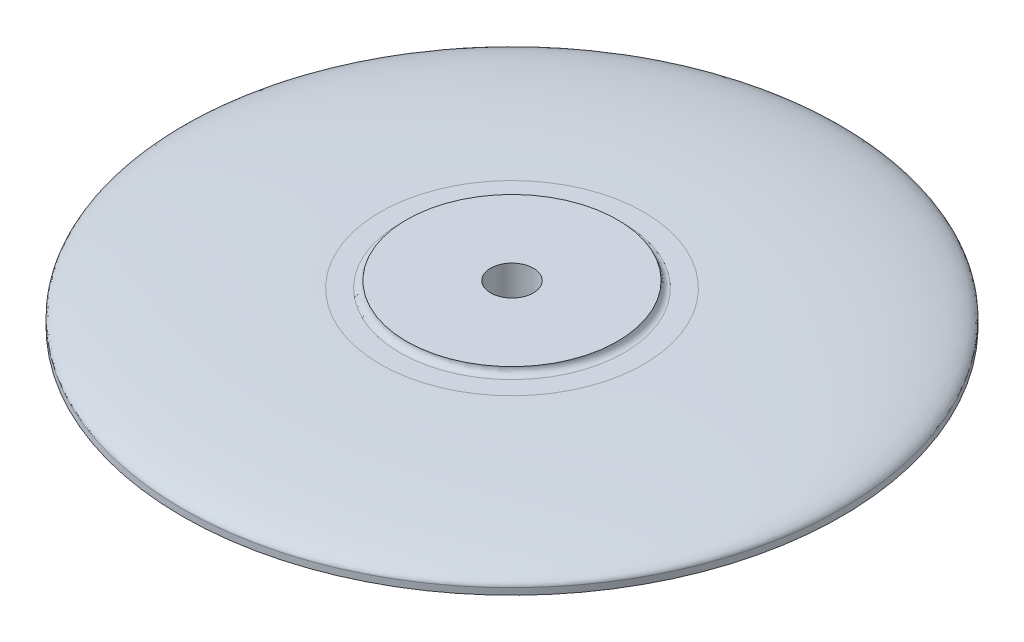
ISO-10303-21;
HEADER;
FILE_DESCRIPTION(('STEP AP214'),'2;1');
FILE_NAME('part.step','',(''),(''),'','','');
FILE_SCHEMA(('AUTOMOTIVE_DESIGN { 1 0 10303 214 1 1 1 1 }'));
ENDSEC;
DATA;
#1=APPLICATION_CONTEXT('core data for automotive mechanical design processes');
#2=APPLICATION_PROTOCOL_DEFINITION('international standard','automotive_design',2000,#1);
#3=PRODUCT_CONTEXT('',#1,'mechanical');
#4=PRODUCT('Part','Part','',(#3));
#5=PRODUCT_RELATED_PRODUCT_CATEGORY('part','',(#4));
#6=PRODUCT_DEFINITION_FORMATION('','',#4);
#7=PRODUCT_DEFINITION_CONTEXT('part definition',#1,'design');
#8=PRODUCT_DEFINITION('design','',#6,#7);
#9=PRODUCT_DEFINITION_SHAPE('','',#8);
#10=(LENGTH_UNIT() NAMED_UNIT(*) SI_UNIT(.MILLI.,.METRE.));
#11=(NAMED_UNIT(*) PLANE_ANGLE_UNIT() SI_UNIT($,.RADIAN.));
#12=(NAMED_UNIT(*) SI_UNIT($,.STERADIAN.) SOLID_ANGLE_UNIT());
#13=UNCERTAINTY_MEASURE_WITH_UNIT(LENGTH_MEASURE(1.E-05),#10,'distance_accuracy_value','');
#14=(GEOMETRIC_REPRESENTATION_CONTEXT(3) GLOBAL_UNCERTAINTY_ASSIGNED_CONTEXT((#13)) GLOBAL_UNIT_ASSIGNED_CONTEXT((#10,
#11,#12)) REPRESENTATION_CONTEXT('',''));
#15=CARTESIAN_POINT('',(0.,0.,0.));
#16=DIRECTION('',(0.,0.,1.));
#17=DIRECTION('',(1.,0.,0.));
#18=AXIS2_PLACEMENT_3D('',#15,#16,#17);
#19=CARTESIAN_POINT('',(0.,5.,0.));
#20=DIRECTION('',(0.,-1.,0.));
#21=DIRECTION('',(0.,0.,-1.));
#22=AXIS2_PLACEMENT_3D('',#19,#20,#21);
#23=CYLINDRICAL_SURFACE('',#22,50.);
#24=CARTESIAN_POINT('',(0.,1.,50.));
#25=CARTESIAN_POINT('',(3.27249234613003,1.,50.));
#26=CARTESIAN_POINT('',(6.54490377749344,1.,49.6776956057626));
#27=CARTESIAN_POINT('',(12.9641284241194,1.,48.4008324345604));
#28=CARTESIAN_POINT('',(16.1107829193642,1.,47.4463052289703));
#29=CARTESIAN_POINT('',(22.1575603171448,1.,44.9416480221584));
#30=CARTESIAN_POINT('',(25.0575337086838,1.,43.3915799504193));
#31=CARTESIAN_POINT('',(30.4994895932765,1.,39.7553812798352));
#32=CARTESIAN_POINT('',(33.0413375300017,1.,37.6693405886531));
#33=CARTESIAN_POINT('',(37.6693405886531,1.,33.0413375300017));
#34=CARTESIAN_POINT('',(39.7553812798342,1.,30.499489593278));
#35=CARTESIAN_POINT('',(43.3915799504203,1.,25.0575337086822));
#36=CARTESIAN_POINT('',(44.9416480221603,1.,22.1575603171404));
#37=CARTESIAN_POINT('',(47.4463052289684,1.,16.1107829193686));
#38=CARTESIAN_POINT('',(48.4008324345603,1.,12.9641284241197));
#39=CARTESIAN_POINT('',(49.6776956057627,1.,6.54490377749318));
#40=CARTESIAN_POINT('',(50.,1.,3.27249234612583));
#41=CARTESIAN_POINT('',(50.,1.,-3.27249234612583));
#42=CARTESIAN_POINT('',(49.6776956057629,1.,-6.54490377749224));
#43=CARTESIAN_POINT('',(48.4008324345602,1.,-12.9641284241205));
#44=CARTESIAN_POINT('',(47.4463052289684,1.,-16.1107829193686));
#45=CARTESIAN_POINT('',(44.9416480221603,1.,-22.1575603171404));
#46=CARTESIAN_POINT('',(43.3915799504191,1.,-25.057533708684));
#47=CARTESIAN_POINT('',(39.7553812798354,1.,-30.4994895932762));
#48=CARTESIAN_POINT('',(37.6693405886559,1.,-33.0413375299988));
#49=CARTESIAN_POINT('',(33.0413375299988,1.,-37.669340588656));
#50=CARTESIAN_POINT('',(30.4994895932736,1.,-39.7553812798371));
#51=CARTESIAN_POINT('',(25.0575337086867,1.,-43.3915799504174));
#52=CARTESIAN_POINT('',(22.1575603171371,1.,-44.9416480221616));
#53=CARTESIAN_POINT('',(16.110782919372,1.,-47.446305228967));
#54=CARTESIAN_POINT('',(12.9641284241176,1.,-48.4008324345608));
#55=CARTESIAN_POINT('',(6.54490377749531,1.,-49.6776956057623));
#56=CARTESIAN_POINT('',(3.27249234612584,1.,-50.));
#57=CARTESIAN_POINT('',(-3.27249234612583,1.,-50.));
#58=CARTESIAN_POINT('',(-6.54490377749304,1.,-49.6776956057627));
#59=CARTESIAN_POINT('',(-12.9641284241197,1.,-48.4008324345604));
#60=CARTESIAN_POINT('',(-16.1107829193699,1.,-47.4463052289679));
#61=CARTESIAN_POINT('',(-22.1575603171389,1.,-44.9416480221609));
#62=CARTESIAN_POINT('',(-25.0575337086829,1.,-43.3915799504198));
#63=CARTESIAN_POINT('',(-30.4994895932772,1.,-39.7553812798347));
#64=CARTESIAN_POINT('',(-33.0413375299988,1.,-37.6693405886559));
#65=CARTESIAN_POINT('',(-37.669340588656,1.,-33.0413375299988));
#66=CARTESIAN_POINT('',(-39.7553812798357,1.,-30.4994895932757));
#67=CARTESIAN_POINT('',(-43.3915799504188,1.,-25.0575337086846));
#68=CARTESIAN_POINT('',(-44.9416480221609,1.,-22.1575603171387));
#69=CARTESIAN_POINT('',(-47.4463052289677,1.,-16.1107829193704));
#70=CARTESIAN_POINT('',(-48.4008324345606,1.,-12.9641284241185));
#71=CARTESIAN_POINT('',(-49.6776956057624,1.,-6.54490377749446));
#72=CARTESIAN_POINT('',(-50.,1.,-3.27249234612575));
#73=CARTESIAN_POINT('',(-50.,1.,3.27249234612591));
#74=CARTESIAN_POINT('',(-49.6776956057629,1.,6.54490377749217));
#75=CARTESIAN_POINT('',(-48.4008324345602,1.,12.9641284241206));
#76=CARTESIAN_POINT('',(-47.4463052289671,1.,16.1107829193719));
#77=CARTESIAN_POINT('',(-44.9416480221617,1.,22.157560317137));
#78=CARTESIAN_POINT('',(-43.3915799504198,1.,25.057533708683));
#79=CARTESIAN_POINT('',(-39.7553812798347,1.,30.4994895932772));
#80=CARTESIAN_POINT('',(-37.6693405886538,1.,33.041337530001));
#81=CARTESIAN_POINT('',(-33.0413375300012,1.,37.6693405886536));
#82=CARTESIAN_POINT('',(-30.499489593271,1.,39.7553812798389));
#83=CARTESIAN_POINT('',(-25.0575337086893,1.,43.3915799504156));
#84=CARTESIAN_POINT('',(-22.1575603171406,1.,44.9416480221601));
#85=CARTESIAN_POINT('',(-16.1107829193685,1.,47.4463052289685));
#86=CARTESIAN_POINT('',(-12.9641284241189,1.,48.4008324345605));
#87=CARTESIAN_POINT('',(-6.54490377749402,1.,49.6776956057625));
#88=CARTESIAN_POINT('',(-3.27249234613004,1.,50.));
#89=CARTESIAN_POINT('',(0.,1.,50.));
#90=(BOUNDED_CURVE() B_SPLINE_CURVE(3,(#24,#25,#26,#27,#28,#29,#30,#31,#32,#33,#34,#35,#36,#37,
#38,#39,#40,#41,#42,#43,#44,#45,#46,#47,#48,#49,#50,#51,#52,#53,#54,#55,#56,#57,#58,#59,#60,#61,
#62,#63,#64,#65,#66,#67,#68,#69,#70,#71,#72,#73,#74,#75,#76,#77,#78,#79,#80,#81,#82,#83,#84,#85,
#86,#87,#88,#89),.UNSPECIFIED.,.T.,.F.) B_SPLINE_CURVE_WITH_KNOTS((4,2,2,2,2,2,2,2,2,2,2,2,2,2,
2,2,2,2,2,2,2,2,2,2,2,2,2,2,2,2,2,2,4),(0.,0.196349540849362,0.392699081698724,
0.589048622548086,0.785398163397448,0.98174770424681,1.17809724509617,1.37444678594553,
1.5707963267949,1.76714586764426,1.96349540849362,2.15984494934298,2.35619449019234,
2.55254403104171,2.74889357189107,2.94524311274043,3.14159265358979,3.33794219443916,
3.53429173528852,3.73064127613788,3.92699081698724,4.1233403578366,4.31968989868597,
4.51603943953533,4.71238898038469,4.90873852123405,5.10508806208341,5.30143760293278,
5.49778714378214,5.6941366846315,5.89048622548086,6.08683576633022,6.28318530717959),
.UNSPECIFIED.) CURVE() GEOMETRIC_REPRESENTATION_ITEM() RATIONAL_B_SPLINE_CURVE((1.,1.,1.,1.,1.,
1.,1.,1.,1.,1.,1.,1.,1.,1.,1.,1.,1.,1.,1.,1.,1.,1.,1.,1.,1.,1.,1.,1.,1.,1.,1.,1.,1.,1.,1.,1.,1.,
1.,1.,1.,1.,1.,1.,1.,1.,1.,1.,1.,1.,1.,1.,1.,1.,1.,1.,1.,1.,1.,1.,1.,1.,1.,1.,1.,1.,1.)) REPRESENTATION_ITEM(''));
#91=CARTESIAN_POINT('',(0.,1.,50.));
#92=VERTEX_POINT('',#91);
#93=EDGE_CURVE('E12',#92,#92,#90,.F.);
#94=ORIENTED_EDGE('',*,*,#93,.T.);
#95=EDGE_LOOP('',(#94));
#96=FACE_BOUND('',#95,.T.);
#97=CARTESIAN_POINT('',(0.,0.,0.));
#98=DIRECTION('',(0.,1.,0.));
#99=DIRECTION('',(0.,0.,1.));
#100=AXIS2_PLACEMENT_3D('',#97,#98,#99);
#101=CIRCLE('',#100,50.);
#102=CARTESIAN_POINT('',(0.,0.,50.));
#103=VERTEX_POINT('',#102);
#104=EDGE_CURVE('E74',#103,#103,#101,.T.);
#105=ORIENTED_EDGE('',*,*,#104,.T.);
#106=EDGE_LOOP('',(#105));
#107=FACE_BOUND('',#106,.T.);
#108=ADVANCED_FACE('F51',(#96,#107),#23,.T.);
#109=CARTESIAN_POINT('',(0.,5.,0.));
#110=DIRECTION('',(0.,1.,0.));
#111=DIRECTION('',(0.,0.,1.));
#112=AXIS2_PLACEMENT_3D('',#109,#110,#111);
#113=PLANE('',#112);
#114=CARTESIAN_POINT('',(0.,5.,20.));
#115=CARTESIAN_POINT('',(-1.30899693845201,5.,20.));
#116=CARTESIAN_POINT('',(-2.61796151099756,5.,19.8710782423041));
#117=CARTESIAN_POINT('',(-5.18565136964763,5.,19.3603329738251));
#118=CARTESIAN_POINT('',(-6.44431316774772,5.,18.9785220915877));
#119=CARTESIAN_POINT('',(-8.86302412685592,5.,17.9766592088637));
#120=CARTESIAN_POINT('',(-10.0230134834748,5.,17.3566319801684));
#121=CARTESIAN_POINT('',(-12.1997958373094,5.,15.9021525119334));
#122=CARTESIAN_POINT('',(-13.2165350120011,5.,15.0677362354608));
#123=CARTESIAN_POINT('',(-15.0677362354608,5.,13.2165350120011));
#124=CARTESIAN_POINT('',(-15.9021525119334,5.,12.1997958373093));
#125=CARTESIAN_POINT('',(-17.3566319801684,5.,10.0230134834747));
#126=CARTESIAN_POINT('',(-17.9766592088637,5.,8.8630241268553));
#127=CARTESIAN_POINT('',(-18.9785220915878,5.,6.44431316774823));
#128=CARTESIAN_POINT('',(-19.3603329738229,5.,5.18565136964758));
#129=CARTESIAN_POINT('',(-19.8710782423063,5.,2.61796151099751));
#130=CARTESIAN_POINT('',(-20.,5.,1.30899693845037));
#131=CARTESIAN_POINT('',(-20.,5.,-1.3089969384503));
#132=CARTESIAN_POINT('',(-19.8710782423041,5.,-2.61796151099784));
#133=CARTESIAN_POINT('',(-19.3603329738251,5.,-5.18565136964734));
#134=CARTESIAN_POINT('',(-18.9785220915877,5.,-6.44431316774772));
#135=CARTESIAN_POINT('',(-17.9766592088637,5.,-8.86302412685592));
#136=CARTESIAN_POINT('',(-17.3566319801662,5.,-10.0230134834736));
#137=CARTESIAN_POINT('',(-15.9021525119356,5.,-12.1997958373105));
#138=CARTESIAN_POINT('',(-15.0677362354619,5.,-13.216535012));
#139=CARTESIAN_POINT('',(-13.216535012,5.,-15.0677362354619));
#140=CARTESIAN_POINT('',(-12.1997958373105,5.,-15.9021525119357));
#141=CARTESIAN_POINT('',(-10.0230134834736,5.,-17.3566319801662));
#142=CARTESIAN_POINT('',(-8.86302412685587,5.,-17.9766592088637));
#143=CARTESIAN_POINT('',(-6.44431316774767,5.,-18.9785220915878));
#144=CARTESIAN_POINT('',(-5.18565136964758,5.,-19.3603329738229));
#145=CARTESIAN_POINT('',(-2.61796151099752,5.,-19.8710782423063));
#146=CARTESIAN_POINT('',(-1.30899693845033,5.,-20.));
#147=CARTESIAN_POINT('',(1.30899693845034,5.,-20.));
#148=CARTESIAN_POINT('',(2.61796151099783,5.,-19.8710782423041));
#149=CARTESIAN_POINT('',(5.18565136964733,5.,-19.3603329738251));
#150=CARTESIAN_POINT('',(6.44431316774772,5.,-18.9785220915855));
#151=CARTESIAN_POINT('',(8.86302412685593,5.,-17.976659208866));
#152=CARTESIAN_POINT('',(10.0230134834736,5.,-17.3566319801662));
#153=CARTESIAN_POINT('',(12.1997958373105,5.,-15.9021525119356));
#154=CARTESIAN_POINT('',(13.216535012,5.,-15.0677362354619));
#155=CARTESIAN_POINT('',(15.0677362354619,5.,-13.216535012));
#156=CARTESIAN_POINT('',(15.9021525119357,5.,-12.1997958373116));
#157=CARTESIAN_POINT('',(17.3566319801662,5.,-10.0230134834725));
#158=CARTESIAN_POINT('',(17.976659208866,5.,-8.86302412685678));
#159=CARTESIAN_POINT('',(18.9785220915855,5.,-6.44431316774683));
#160=CARTESIAN_POINT('',(19.360332973824,5.,-5.18565136964756));
#161=CARTESIAN_POINT('',(19.8710782423052,5.,-2.61796151099754));
#162=CARTESIAN_POINT('',(20.,5.,-1.30899693845033));
#163=CARTESIAN_POINT('',(20.,5.,1.30899693845033));
#164=CARTESIAN_POINT('',(19.8710782423052,5.,2.61796151099785));
#165=CARTESIAN_POINT('',(19.360332973824,5.,5.18565136964731));
#166=CARTESIAN_POINT('',(18.9785220915878,5.,6.44431316774795));
#167=CARTESIAN_POINT('',(17.9766592088637,5.,8.86302412685563));
#168=CARTESIAN_POINT('',(17.3566319801691,5.,10.0230134834737));
#169=CARTESIAN_POINT('',(15.9021525119327,5.,12.1997958373103));
#170=CARTESIAN_POINT('',(15.067736235461,5.,13.2165350119998));
#171=CARTESIAN_POINT('',(13.2165350120009,5.,15.0677362354622));
#172=CARTESIAN_POINT('',(12.1997958373103,5.,15.9021525119327));
#173=CARTESIAN_POINT('',(10.0230134834738,5.,17.3566319801691));
#174=CARTESIAN_POINT('',(8.86302412685662,5.,17.9766592088626));
#175=CARTESIAN_POINT('',(6.44431316774697,5.,18.9785220915889));
#176=CARTESIAN_POINT('',(5.18565136964759,5.,19.3603329738234));
#177=CARTESIAN_POINT('',(2.61796151099754,5.,19.8710782423058));
#178=CARTESIAN_POINT('',(1.30899693845201,5.,20.));
#179=CARTESIAN_POINT('',(0.,5.,20.));
#180=(BOUNDED_CURVE() B_SPLINE_CURVE(3,(#114,#115,#116,#117,#118,#119,#120,#121,#122,#123,#124,
#125,#126,#127,#128,#129,#130,#131,#132,#133,#134,#135,#136,#137,#138,#139,#140,#141,#142,#143,
#144,#145,#146,#147,#148,#149,#150,#151,#152,#153,#154,#155,#156,#157,#158,#159,#160,#161,#162,
#163,#164,#165,#166,#167,#168,#169,#170,#171,#172,#173,#174,#175,#176,#177,#178,#179),
.UNSPECIFIED.,.T.,.F.) B_SPLINE_CURVE_WITH_KNOTS((4,2,2,2,2,2,2,2,2,2,2,2,2,2,2,2,2,2,2,2,2,2,2,
2,2,2,2,2,2,2,2,2,4),(0.,0.196349540849362,0.392699081698725,0.589048622548086,
0.785398163397448,0.981747704246811,1.17809724509617,1.37444678594553,1.5707963267949,
1.76714586764426,1.96349540849362,2.15984494934298,2.35619449019234,2.55254403104171,
2.74889357189107,2.94524311274043,3.14159265358979,3.33794219443916,3.53429173528852,
3.73064127613788,3.92699081698724,4.1233403578366,4.31968989868597,4.51603943953533,
4.71238898038469,4.90873852123405,5.10508806208341,5.30143760293278,5.49778714378214,
5.6941366846315,5.89048622548086,6.08683576633022,6.28318530717959),
.UNSPECIFIED.) CURVE() GEOMETRIC_REPRESENTATION_ITEM() RATIONAL_B_SPLINE_CURVE((1.,1.,1.,1.,1.,
1.,1.,1.,1.,1.,1.,1.,1.,1.,1.,1.,1.,1.,1.,1.,1.,1.,1.,1.,1.,1.,1.,1.,1.,1.,1.,1.,1.,1.,1.,1.,1.,
1.,1.,1.,1.,1.,1.,1.,1.,1.,1.,1.,1.,1.,1.,1.,1.,1.,1.,1.,1.,1.,1.,1.,1.,1.,1.,1.,1.,1.)) REPRESENTATION_ITEM(''));
#181=CARTESIAN_POINT('',(0.,5.,20.));
#182=VERTEX_POINT('',#181);
#183=EDGE_CURVE('E64',#182,#182,#180,.F.);
#184=ORIENTED_EDGE('',*,*,#183,.T.);
#185=EDGE_LOOP('',(#184));
#186=FACE_BOUND('',#185,.T.);
#187=CARTESIAN_POINT('',(0.,5.,0.));
#188=DIRECTION('',(0.,1.,0.));
#189=DIRECTION('',(0.,0.,1.));
#190=AXIS2_PLACEMENT_3D('',#187,#188,#189);
#191=CIRCLE('',#190,17.);
#192=CARTESIAN_POINT('',(0.,5.,17.));
#193=VERTEX_POINT('',#192);
#194=EDGE_CURVE('E69',#193,#193,#191,.F.);
#195=ORIENTED_EDGE('',*,*,#194,.T.);
#196=EDGE_LOOP('',(#195));
#197=FACE_BOUND('',#196,.T.);
#198=ADVANCED_FACE('F87',(#186,#197),#113,.T.);
#199=CARTESIAN_POINT('',(0.,0.,0.));
#200=DIRECTION('',(0.,1.,0.));
#201=DIRECTION('',(0.,0.,1.));
#202=AXIS2_PLACEMENT_3D('',#199,#200,#201);
#203=PLANE('',#202);
#204=CARTESIAN_POINT('',(0.,0.,0.));
#205=DIRECTION('',(0.,1.,0.));
#206=DIRECTION('',(0.,0.,1.));
#207=AXIS2_PLACEMENT_3D('',#204,#205,#206);
#208=CIRCLE('',#207,3.25);
#209=CARTESIAN_POINT('',(0.,0.,3.25));
#210=VERTEX_POINT('',#209);
#211=EDGE_CURVE('E138',#210,#210,#208,.T.);
#212=ORIENTED_EDGE('',*,*,#211,.T.);
#213=EDGE_LOOP('',(#212));
#214=FACE_BOUND('',#213,.T.);
#215=ORIENTED_EDGE('',*,*,#104,.F.);
#216=EDGE_LOOP('',(#215));
#217=FACE_BOUND('',#216,.T.);
#218=ADVANCED_FACE('F97',(#214,#217),#203,.F.);
#219=CARTESIAN_POINT('',(0.,6.,0.));
#220=DIRECTION('',(0.,1.,0.));
#221=DIRECTION('',(0.,0.,1.));
#222=AXIS2_PLACEMENT_3D('',#219,#220,#221);
#223=PLANE('',#222);
#224=CARTESIAN_POINT('',(0.,6.,0.));
#225=DIRECTION('',(0.,1.,0.));
#226=DIRECTION('',(0.,0.,1.));
#227=AXIS2_PLACEMENT_3D('',#224,#225,#226);
#228=CIRCLE('',#227,3.25);
#229=CARTESIAN_POINT('',(0.,6.,3.25));
#230=VERTEX_POINT('',#229);
#231=EDGE_CURVE('E140',#230,#230,#228,.T.);
#232=ORIENTED_EDGE('',*,*,#231,.F.);
#233=EDGE_LOOP('',(#232));
#234=FACE_BOUND('',#233,.T.);
#235=CARTESIAN_POINT('',(0.,6.,0.));
#236=DIRECTION('',(0.,1.,0.));
#237=DIRECTION('',(0.,0.,1.));
#238=AXIS2_PLACEMENT_3D('',#235,#236,#237);
#239=CIRCLE('',#238,16.);
#240=CARTESIAN_POINT('',(0.,6.,16.));
#241=VERTEX_POINT('',#240);
#242=EDGE_CURVE('E79',#241,#241,#239,.T.);
#243=ORIENTED_EDGE('',*,*,#242,.T.);
#244=EDGE_LOOP('',(#243));
#245=FACE_BOUND('',#244,.T.);
#246=ADVANCED_FACE('F98',(#234,#245),#223,.T.);
#247=CARTESIAN_POINT('',(0.,0.,0.));
#248=DIRECTION('',(0.,1.,0.));
#249=DIRECTION('',(0.,0.,1.));
#250=AXIS2_PLACEMENT_3D('',#247,#248,#249);
#251=CYLINDRICAL_SURFACE('',#250,3.25);
#252=ORIENTED_EDGE('',*,*,#211,.F.);
#253=EDGE_LOOP('',(#252));
#254=FACE_BOUND('',#253,.T.);
#255=ORIENTED_EDGE('',*,*,#231,.T.);
#256=EDGE_LOOP('',(#255));
#257=FACE_BOUND('',#256,.T.);
#258=ADVANCED_FACE('F128',(#254,#257),#251,.F.);
#259=CARTESIAN_POINT('',(0.,6.,0.));
#260=DIRECTION('',(0.,1.,0.));
#261=DIRECTION('',(0.,0.,1.));
#262=AXIS2_PLACEMENT_3D('',#259,#260,#261);
#263=TOROIDAL_SURFACE('',#262,17.,1.);
#264=ORIENTED_EDGE('',*,*,#194,.F.);
#265=EDGE_LOOP('',(#264));
#266=FACE_BOUND('',#265,.T.);
#267=ORIENTED_EDGE('',*,*,#242,.F.);
#268=EDGE_LOOP('',(#267));
#269=FACE_BOUND('',#268,.T.);
#270=ADVANCED_FACE('F105',(#266,#269),#263,.F.);
#271=CARTESIAN_POINT('',(0.,5.,20.));
#272=CARTESIAN_POINT('',(1.30899693845201,5.,20.));
#273=CARTESIAN_POINT('',(2.61796151099754,5.,19.8710782423058));
#274=CARTESIAN_POINT('',(5.18565136964759,5.,19.3603329738234));
#275=CARTESIAN_POINT('',(6.44431316774697,5.,18.9785220915889));
#276=CARTESIAN_POINT('',(8.86302412685662,5.,17.9766592088626));
#277=CARTESIAN_POINT('',(10.0230134834738,5.,17.3566319801691));
#278=CARTESIAN_POINT('',(12.1997958373103,5.,15.9021525119327));
#279=CARTESIAN_POINT('',(13.2165350120009,5.,15.0677362354622));
#280=CARTESIAN_POINT('',(15.067736235461,5.,13.2165350119998));
#281=CARTESIAN_POINT('',(15.9021525119327,5.,12.1997958373103));
#282=CARTESIAN_POINT('',(17.3566319801691,5.,10.0230134834737));
#283=CARTESIAN_POINT('',(17.9766592088637,5.,8.86302412685563));
#284=CARTESIAN_POINT('',(18.9785220915878,5.,6.44431316774795));
#285=CARTESIAN_POINT('',(19.360332973824,5.,5.18565136964731));
#286=CARTESIAN_POINT('',(19.8710782423052,5.,2.61796151099785));
#287=CARTESIAN_POINT('',(20.,5.,1.30899693845033));
#288=CARTESIAN_POINT('',(20.,5.,-1.30899693845033));
#289=CARTESIAN_POINT('',(19.8710782423052,5.,-2.61796151099754));
#290=CARTESIAN_POINT('',(19.360332973824,5.,-5.18565136964756));
#291=CARTESIAN_POINT('',(18.9785220915855,5.,-6.44431316774683));
#292=CARTESIAN_POINT('',(17.976659208866,5.,-8.86302412685678));
#293=CARTESIAN_POINT('',(17.3566319801662,5.,-10.0230134834725));
#294=CARTESIAN_POINT('',(15.9021525119357,5.,-12.1997958373116));
#295=CARTESIAN_POINT('',(15.0677362354619,5.,-13.216535012));
#296=CARTESIAN_POINT('',(13.216535012,5.,-15.0677362354619));
#297=CARTESIAN_POINT('',(12.1997958373105,5.,-15.9021525119356));
#298=CARTESIAN_POINT('',(10.0230134834736,5.,-17.3566319801662));
#299=CARTESIAN_POINT('',(8.86302412685593,5.,-17.976659208866));
#300=CARTESIAN_POINT('',(6.44431316774772,5.,-18.9785220915855));
#301=CARTESIAN_POINT('',(5.18565136964733,5.,-19.3603329738251));
#302=CARTESIAN_POINT('',(2.61796151099783,5.,-19.8710782423041));
#303=CARTESIAN_POINT('',(1.30899693845034,5.,-20.));
#304=CARTESIAN_POINT('',(-1.30899693845033,5.,-20.));
#305=CARTESIAN_POINT('',(-2.61796151099752,5.,-19.8710782423063));
#306=CARTESIAN_POINT('',(-5.18565136964758,5.,-19.3603329738229));
#307=CARTESIAN_POINT('',(-6.44431316774767,5.,-18.9785220915878));
#308=CARTESIAN_POINT('',(-8.86302412685587,5.,-17.9766592088637));
#309=CARTESIAN_POINT('',(-10.0230134834736,5.,-17.3566319801662));
#310=CARTESIAN_POINT('',(-12.1997958373105,5.,-15.9021525119357));
#311=CARTESIAN_POINT('',(-13.216535012,5.,-15.0677362354619));
#312=CARTESIAN_POINT('',(-15.0677362354619,5.,-13.216535012));
#313=CARTESIAN_POINT('',(-15.9021525119356,5.,-12.1997958373105));
#314=CARTESIAN_POINT('',(-17.3566319801662,5.,-10.0230134834736));
#315=CARTESIAN_POINT('',(-17.9766592088637,5.,-8.86302412685592));
#316=CARTESIAN_POINT('',(-18.9785220915877,5.,-6.44431316774772));
#317=CARTESIAN_POINT('',(-19.3603329738251,5.,-5.18565136964734));
#318=CARTESIAN_POINT('',(-19.8710782423041,5.,-2.61796151099784));
#319=CARTESIAN_POINT('',(-20.,5.,-1.3089969384503));
#320=CARTESIAN_POINT('',(-20.,5.,1.30899693845037));
#321=CARTESIAN_POINT('',(-19.8710782423063,5.,2.61796151099751));
#322=CARTESIAN_POINT('',(-19.3603329738229,5.,5.18565136964758));
#323=CARTESIAN_POINT('',(-18.9785220915878,5.,6.44431316774823));
#324=CARTESIAN_POINT('',(-17.9766592088637,5.,8.8630241268553));
#325=CARTESIAN_POINT('',(-17.3566319801684,5.,10.0230134834747));
#326=CARTESIAN_POINT('',(-15.9021525119334,5.,12.1997958373093));
#327=CARTESIAN_POINT('',(-15.0677362354608,5.,13.2165350120011));
#328=CARTESIAN_POINT('',(-13.2165350120011,5.,15.0677362354608));
#329=CARTESIAN_POINT('',(-12.1997958373094,5.,15.9021525119334));
#330=CARTESIAN_POINT('',(-10.0230134834748,5.,17.3566319801684));
#331=CARTESIAN_POINT('',(-8.86302412685592,5.,17.9766592088637));
#332=CARTESIAN_POINT('',(-6.44431316774772,5.,18.9785220915877));
#333=CARTESIAN_POINT('',(-5.18565136964763,5.,19.3603329738251));
#334=CARTESIAN_POINT('',(-2.61796151099756,5.,19.8710782423041));
#335=CARTESIAN_POINT('',(-1.30899693845201,5.,20.));
#336=CARTESIAN_POINT('',(0.,5.,20.));
#337=CARTESIAN_POINT('',(0.,5.,50.));
#338=CARTESIAN_POINT('',(3.27249234613003,5.,49.9999999999909));
#339=CARTESIAN_POINT('',(6.54490377749131,5.,49.6776956057576));
#340=CARTESIAN_POINT('',(12.9641284241215,5.,48.4008324345654));
#341=CARTESIAN_POINT('',(16.1107829193669,5.,47.4463052289723));
#342=CARTESIAN_POINT('',(22.1575603171421,5.,44.9416480221564));
#343=CARTESIAN_POINT('',(25.0575337086815,5.00000000000454,43.3915799504193));
#344=CARTESIAN_POINT('',(30.4994895932787,4.99999999999546,39.7553812798352));
#345=CARTESIAN_POINT('',(33.0413375300085,4.99999999999999,37.6693405886554));
#346=CARTESIAN_POINT('',(37.6693405886463,4.99999999999999,33.0413375299994));
#347=CARTESIAN_POINT('',(39.7553812798352,5.00000000000454,30.4994895932787));
#348=CARTESIAN_POINT('',(43.3915799504193,4.99999999999546,25.0575337086815));
#349=CARTESIAN_POINT('',(44.9416480221592,5.,22.1575603171399));
#350=CARTESIAN_POINT('',(47.4463052289695,5.,16.110782919369));
#351=CARTESIAN_POINT('',(48.4008324345577,5.00000000000057,12.9641284241201));
#352=CARTESIAN_POINT('',(49.6776956057653,4.99999999999943,6.54490377749279));
#353=CARTESIAN_POINT('',(50.,5.,3.27249234612583));
#354=CARTESIAN_POINT('',(50.,5.,-3.27249234612583));
#355=CARTESIAN_POINT('',(49.6776956057653,5.,-6.54490377749272));
#356=CARTESIAN_POINT('',(48.4008324345578,5.,-12.96412842412));
#357=CARTESIAN_POINT('',(47.4463052289695,5.0000000000017,-16.1107829193691));
#358=CARTESIAN_POINT('',(44.9416480221592,4.9999999999983,-22.15756031714));
#359=CARTESIAN_POINT('',(43.3915799504234,5.00000000000454,-25.0575337086823));
#360=CARTESIAN_POINT('',(39.7553812798312,4.99999999999545,-30.4994895932779));
#361=CARTESIAN_POINT('',(37.6693405886514,5.00000000000624,-33.0413375299943));
#362=CARTESIAN_POINT('',(33.0413375300033,4.99999999999376,-37.6693405886605));
#363=CARTESIAN_POINT('',(30.4994895932712,5.00000000000454,-39.7553812798402));
#364=CARTESIAN_POINT('',(25.0575337086891,4.99999999999546,-43.3915799504142));
#365=CARTESIAN_POINT('',(22.1575603171375,5.,-44.9416480221627));
#366=CARTESIAN_POINT('',(16.1107829193716,5.,-47.4463052289659));
#367=CARTESIAN_POINT('',(12.9641284241173,5.,-48.4008324345549));
#368=CARTESIAN_POINT('',(6.54490377749557,5.,-49.6776956057681));
#369=CARTESIAN_POINT('',(3.27249234612584,5.,-50.));
#370=CARTESIAN_POINT('',(-3.27249234612583,5.,-50.));
#371=CARTESIAN_POINT('',(-6.54490377749208,5.,-49.6776956057591));
#372=CARTESIAN_POINT('',(-12.9641284241207,5.,-48.400832434564));
#373=CARTESIAN_POINT('',(-16.1107829193692,5.,-47.446305228966));
#374=CARTESIAN_POINT('',(-22.1575603171397,5.,-44.9416480221628));
#375=CARTESIAN_POINT('',(-25.0575337086823,5.00000000000454,-43.3915799504234));
#376=CARTESIAN_POINT('',(-30.4994895932779,4.99999999999546,-39.7553812798312));
#377=CARTESIAN_POINT('',(-33.0413375299943,5.00000000000624,-37.6693405886514));
#378=CARTESIAN_POINT('',(-37.6693405886605,4.99999999999376,-33.0413375300033));
#379=CARTESIAN_POINT('',(-39.7553812798402,5.00000000000454,-30.4994895932757));
#380=CARTESIAN_POINT('',(-43.3915799504142,4.99999999999546,-25.0575337086846));
#381=CARTESIAN_POINT('',(-44.9416480221581,5.,-22.1575603171375));
#382=CARTESIAN_POINT('',(-47.4463052289705,5.,-16.1107829193716));
#383=CARTESIAN_POINT('',(-48.4008324345504,5.00000000000057,-12.9641284241174));
#384=CARTESIAN_POINT('',(-49.6776956057727,4.99999999999943,-6.54490377749559));
#385=CARTESIAN_POINT('',(-50.,5.,-3.27249234612575));
#386=CARTESIAN_POINT('',(-50.,5.,3.27249234612591));
#387=CARTESIAN_POINT('',(-49.6776956057682,5.,6.54490377749435));
#388=CARTESIAN_POINT('',(-48.4008324345549,5.,12.9641284241184));
#389=CARTESIAN_POINT('',(-47.446305228966,5.,16.1107829193714));
#390=CARTESIAN_POINT('',(-44.9416480221628,5.,22.1575603171374));
#391=CARTESIAN_POINT('',(-43.3915799504188,5.,25.0575337086823));
#392=CARTESIAN_POINT('',(-39.7553812798357,5.,30.4994895932779));
#393=CARTESIAN_POINT('',(-37.6693405886561,4.99999999999999,33.0413375300032));
#394=CARTESIAN_POINT('',(-33.0413375299989,4.99999999999999,37.6693405886513));
#395=CARTESIAN_POINT('',(-30.4994895932689,5.,39.7553812798357));
#396=CARTESIAN_POINT('',(-25.0575337086914,5.,43.3915799504188));
#397=CARTESIAN_POINT('',(-22.1575603171398,5.,44.9416480221536));
#398=CARTESIAN_POINT('',(-16.1107829193693,5.,47.446305228975));
#399=CARTESIAN_POINT('',(-12.9641284241196,5.,48.4008324345595));
#400=CARTESIAN_POINT('',(-6.54490377749333,5.,49.6776956057636));
#401=CARTESIAN_POINT('',(-3.27249234613004,5.,50.0000000000091));
#402=CARTESIAN_POINT('',(0.,5.,50.));
#403=CARTESIAN_POINT('',(0.,1.,50.));
#404=CARTESIAN_POINT('',(3.27249234613003,1.,50.));
#405=CARTESIAN_POINT('',(6.54490377749344,1.,49.6776956057626));
#406=CARTESIAN_POINT('',(12.9641284241194,1.,48.4008324345604));
#407=CARTESIAN_POINT('',(16.1107829193642,1.,47.4463052289703));
#408=CARTESIAN_POINT('',(22.1575603171448,1.,44.9416480221584));
#409=CARTESIAN_POINT('',(25.0575337086838,1.,43.3915799504193));
#410=CARTESIAN_POINT('',(30.4994895932765,1.,39.7553812798352));
#411=CARTESIAN_POINT('',(33.0413375300017,1.,37.6693405886531));
#412=CARTESIAN_POINT('',(37.6693405886531,1.,33.0413375300017));
#413=CARTESIAN_POINT('',(39.7553812798342,1.,30.499489593278));
#414=CARTESIAN_POINT('',(43.3915799504203,1.,25.0575337086822));
#415=CARTESIAN_POINT('',(44.9416480221603,1.,22.1575603171404));
#416=CARTESIAN_POINT('',(47.4463052289684,1.,16.1107829193686));
#417=CARTESIAN_POINT('',(48.4008324345603,1.,12.9641284241197));
#418=CARTESIAN_POINT('',(49.6776956057627,1.,6.54490377749318));
#419=CARTESIAN_POINT('',(50.,1.,3.27249234612583));
#420=CARTESIAN_POINT('',(50.,1.,-3.27249234612583));
#421=CARTESIAN_POINT('',(49.6776956057629,1.,-6.54490377749224));
#422=CARTESIAN_POINT('',(48.4008324345602,1.,-12.9641284241205));
#423=CARTESIAN_POINT('',(47.4463052289684,1.,-16.1107829193686));
#424=CARTESIAN_POINT('',(44.9416480221603,1.,-22.1575603171404));
#425=CARTESIAN_POINT('',(43.3915799504191,1.,-25.057533708684));
#426=CARTESIAN_POINT('',(39.7553812798354,1.,-30.4994895932762));
#427=CARTESIAN_POINT('',(37.6693405886559,1.,-33.0413375299988));
#428=CARTESIAN_POINT('',(33.0413375299988,1.,-37.669340588656));
#429=CARTESIAN_POINT('',(30.4994895932736,1.,-39.7553812798371));
#430=CARTESIAN_POINT('',(25.0575337086867,1.,-43.3915799504174));
#431=CARTESIAN_POINT('',(22.1575603171371,1.,-44.9416480221616));
#432=CARTESIAN_POINT('',(16.110782919372,1.,-47.446305228967));
#433=CARTESIAN_POINT('',(12.9641284241176,1.,-48.4008324345608));
#434=CARTESIAN_POINT('',(6.54490377749531,1.,-49.6776956057623));
#435=CARTESIAN_POINT('',(3.27249234612584,1.,-50.));
#436=CARTESIAN_POINT('',(-3.27249234612583,1.,-50.));
#437=CARTESIAN_POINT('',(-6.54490377749304,1.,-49.6776956057627));
#438=CARTESIAN_POINT('',(-12.9641284241197,1.,-48.4008324345604));
#439=CARTESIAN_POINT('',(-16.1107829193699,1.,-47.4463052289679));
#440=CARTESIAN_POINT('',(-22.1575603171389,1.,-44.9416480221609));
#441=CARTESIAN_POINT('',(-25.0575337086829,1.,-43.3915799504198));
#442=CARTESIAN_POINT('',(-30.4994895932772,1.,-39.7553812798347));
#443=CARTESIAN_POINT('',(-33.0413375299988,1.,-37.6693405886559));
#444=CARTESIAN_POINT('',(-37.669340588656,1.,-33.0413375299988));
#445=CARTESIAN_POINT('',(-39.7553812798357,1.,-30.4994895932757));
#446=CARTESIAN_POINT('',(-43.3915799504188,1.,-25.0575337086846));
#447=CARTESIAN_POINT('',(-44.9416480221609,1.,-22.1575603171387));
#448=CARTESIAN_POINT('',(-47.4463052289677,1.,-16.1107829193704));
#449=CARTESIAN_POINT('',(-48.4008324345606,1.,-12.9641284241185));
#450=CARTESIAN_POINT('',(-49.6776956057624,1.,-6.54490377749446));
#451=CARTESIAN_POINT('',(-50.,1.,-3.27249234612575));
#452=CARTESIAN_POINT('',(-50.,1.,3.27249234612591));
#453=CARTESIAN_POINT('',(-49.6776956057629,1.,6.54490377749217));
#454=CARTESIAN_POINT('',(-48.4008324345602,1.,12.9641284241206));
#455=CARTESIAN_POINT('',(-47.4463052289671,1.,16.1107829193719));
#456=CARTESIAN_POINT('',(-44.9416480221617,1.,22.157560317137));
#457=CARTESIAN_POINT('',(-43.3915799504198,1.,25.057533708683));
#458=CARTESIAN_POINT('',(-39.7553812798347,1.,30.4994895932772));
#459=CARTESIAN_POINT('',(-37.6693405886538,1.,33.041337530001));
#460=CARTESIAN_POINT('',(-33.0413375300012,1.,37.6693405886536));
#461=CARTESIAN_POINT('',(-30.499489593271,1.,39.7553812798389));
#462=CARTESIAN_POINT('',(-25.0575337086893,1.,43.3915799504156));
#463=CARTESIAN_POINT('',(-22.1575603171406,1.,44.9416480221601));
#464=CARTESIAN_POINT('',(-16.1107829193685,1.,47.4463052289685));
#465=CARTESIAN_POINT('',(-12.9641284241189,1.,48.4008324345605));
#466=CARTESIAN_POINT('',(-6.54490377749402,1.,49.6776956057625));
#467=CARTESIAN_POINT('',(-3.27249234613004,1.,50.));
#468=CARTESIAN_POINT('',(0.,1.,50.));
#469=(BOUNDED_SURFACE() B_SPLINE_SURFACE(2,3,((#271,#272,#273,#274,#275,#276,#277,#278,#279,
#280,#281,#282,#283,#284,#285,#286,#287,#288,#289,#290,#291,#292,#293,#294,#295,#296,#297,#298,
#299,#300,#301,#302,#303,#304,#305,#306,#307,#308,#309,#310,#311,#312,#313,#314,#315,#316,#317,
#318,#319,#320,#321,#322,#323,#324,#325,#326,#327,#328,#329,#330,#331,#332,#333,#334,#335,#336),
(#337,#338,#339,#340,#341,#342,#343,#344,#345,#346,#347,#348,#349,#350,#351,#352,#353,#354,#355,
#356,#357,#358,#359,#360,#361,#362,#363,#364,#365,#366,#367,#368,#369,#370,#371,#372,#373,#374,
#375,#376,#377,#378,#379,#380,#381,#382,#383,#384,#385,#386,#387,#388,#389,#390,#391,#392,#393,
#394,#395,#396,#397,#398,#399,#400,#401,#402),(#403,#404,#405,#406,#407,#408,#409,#410,#411,
#412,#413,#414,#415,#416,#417,#418,#419,#420,#421,#422,#423,#424,#425,#426,#427,#428,#429,#430,
#431,#432,#433,#434,#435,#436,#437,#438,#439,#440,#441,#442,#443,#444,#445,#446,#447,#448,#449,
#450,#451,#452,#453,#454,#455,#456,#457,#458,#459,#460,#461,#462,#463,#464,#465,#466,#467,
#468)),.UNSPECIFIED.,.F.,.T.,.F.) B_SPLINE_SURFACE_WITH_KNOTS((3,3),(4,2,2,2,2,2,2,2,2,2,2,2,2,
2,2,2,2,2,2,2,2,2,2,2,2,2,2,2,2,2,2,2,4),(0.,1.),(0.,0.196349540849362,0.392699081698724,
0.589048622548086,0.785398163397448,0.98174770424681,1.17809724509617,1.37444678594553,
1.5707963267949,1.76714586764426,1.96349540849362,2.15984494934298,2.35619449019234,
2.55254403104171,2.74889357189107,2.94524311274043,3.14159265358979,3.33794219443916,
3.53429173528852,3.73064127613788,3.92699081698724,4.1233403578366,4.31968989868597,
4.51603943953533,4.71238898038469,4.90873852123405,5.10508806208341,5.30143760293278,
5.49778714378214,5.6941366846315,5.89048622548086,6.08683576633022,6.28318530717959),
.UNSPECIFIED.) GEOMETRIC_REPRESENTATION_ITEM() RATIONAL_B_SPLINE_SURFACE(((1.,1.,1.,1.,1.,1.,1.,
1.,1.,1.,1.,1.,1.,1.,1.,1.,1.,1.,1.,1.,1.,1.,1.,1.,1.,1.,1.,1.,1.,1.,1.,1.,1.,1.,1.,1.,1.,1.,1.,
1.,1.,1.,1.,1.,1.,1.,1.,1.,1.,1.,1.,1.,1.,1.,1.,1.,1.,1.,1.,1.,1.,1.,1.,1.,1.,1.),
(0.707106781186548,0.707106781186548,0.707106781186548,0.707106781186548,0.707106781186548,
0.707106781186548,0.707106781186548,0.707106781186548,0.707106781186548,0.707106781186548,
0.707106781186548,0.707106781186548,0.707106781186548,0.707106781186548,0.707106781186548,
0.707106781186548,0.707106781186548,0.707106781186548,0.707106781186548,0.707106781186548,
0.707106781186548,0.707106781186548,0.707106781186548,0.707106781186548,0.707106781186548,
0.707106781186548,0.707106781186548,0.707106781186548,0.707106781186548,0.707106781186548,
0.707106781186548,0.707106781186548,0.707106781186548,0.707106781186548,0.707106781186548,
0.707106781186548,0.707106781186548,0.707106781186548,0.707106781186548,0.707106781186548,
0.707106781186548,0.707106781186548,0.707106781186548,0.707106781186548,0.707106781186548,
0.707106781186548,0.707106781186548,0.707106781186548,0.707106781186548,0.707106781186548,
0.707106781186548,0.707106781186548,0.707106781186548,0.707106781186548,0.707106781186548,
0.707106781186548,0.707106781186548,0.707106781186548,0.707106781186548,0.707106781186548,
0.707106781186548,0.707106781186548,0.707106781186548,0.707106781186548,0.707106781186548,
0.707106781186548),(1.,1.,1.,1.,1.,1.,1.,1.,1.,1.,1.,1.,1.,1.,1.,1.,1.,1.,1.,1.,1.,1.,1.,1.,1.,
1.,1.,1.,1.,1.,1.,1.,1.,1.,1.,1.,1.,1.,1.,1.,1.,1.,1.,1.,1.,1.,1.,1.,1.,1.,1.,1.,1.,1.,1.,1.,1.,
1.,1.,1.,1.,1.,1.,1.,1.,1.))) REPRESENTATION_ITEM('') SURFACE());
#470=ORIENTED_EDGE('',*,*,#93,.F.);
#471=EDGE_LOOP('',(#470));
#472=FACE_BOUND('',#471,.T.);
#473=ORIENTED_EDGE('',*,*,#183,.F.);
#474=EDGE_LOOP('',(#473));
#475=FACE_BOUND('',#474,.T.);
#476=ADVANCED_FACE('F54',(#472,#475),#469,.T.);
#477=CLOSED_SHELL('',(#108,#198,#218,#246,#258,#270,#476));
#478=MANIFOLD_SOLID_BREP('B2',#477);
#479=ADVANCED_BREP_SHAPE_REPRESENTATION('',(#18,#478),#14);
#480=SHAPE_DEFINITION_REPRESENTATION(#9,#479);
ENDSEC;
END-ISO-10303-21;
